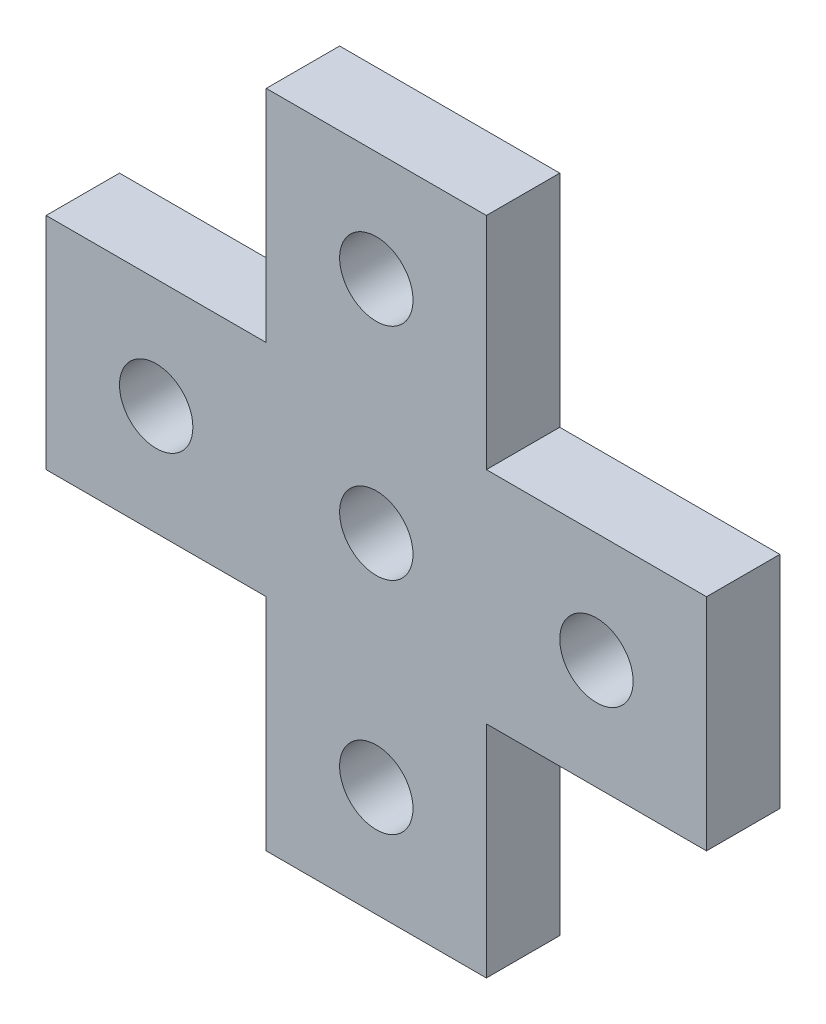
ISO-10303-21;
HEADER;
FILE_DESCRIPTION(('STEP AP214'),'2;1');
FILE_NAME('part.step','',(''),(''),'','','');
FILE_SCHEMA(('AUTOMOTIVE_DESIGN { 1 0 10303 214 1 1 1 1 }'));
ENDSEC;
DATA;
#1=APPLICATION_CONTEXT('core data for automotive mechanical design processes');
#2=APPLICATION_PROTOCOL_DEFINITION('international standard','automotive_design',2000,#1);
#3=PRODUCT_CONTEXT('',#1,'mechanical');
#4=PRODUCT('Part','Part','',(#3));
#5=PRODUCT_RELATED_PRODUCT_CATEGORY('part','',(#4));
#6=PRODUCT_DEFINITION_FORMATION('','',#4);
#7=PRODUCT_DEFINITION_CONTEXT('part definition',#1,'design');
#8=PRODUCT_DEFINITION('design','',#6,#7);
#9=PRODUCT_DEFINITION_SHAPE('','',#8);
#10=(LENGTH_UNIT() NAMED_UNIT(*) SI_UNIT(.MILLI.,.METRE.));
#11=(NAMED_UNIT(*) PLANE_ANGLE_UNIT() SI_UNIT($,.RADIAN.));
#12=(NAMED_UNIT(*) SI_UNIT($,.STERADIAN.) SOLID_ANGLE_UNIT());
#13=UNCERTAINTY_MEASURE_WITH_UNIT(LENGTH_MEASURE(1.E-05),#10,'distance_accuracy_value','');
#14=(GEOMETRIC_REPRESENTATION_CONTEXT(3) GLOBAL_UNCERTAINTY_ASSIGNED_CONTEXT((#13)) GLOBAL_UNIT_ASSIGNED_CONTEXT((#10,
#11,#12)) REPRESENTATION_CONTEXT('',''));
#15=CARTESIAN_POINT('',(0.,0.,0.));
#16=DIRECTION('',(0.,0.,1.));
#17=DIRECTION('',(1.,0.,0.));
#18=AXIS2_PLACEMENT_3D('',#15,#16,#17);
#19=CARTESIAN_POINT('',(0.,0.,3.));
#20=DIRECTION('',(0.,0.,-1.));
#21=DIRECTION('',(-1.,0.,0.));
#22=AXIS2_PLACEMENT_3D('',#19,#20,#21);
#23=PLANE('',#22);
#24=CARTESIAN_POINT('',(199.7507761496,161.428489513,3.));
#25=DIRECTION('',(0.,0.,1.));
#26=DIRECTION('',(1.,0.,0.));
#27=AXIS2_PLACEMENT_3D('',#24,#25,#26);
#28=CIRCLE('',#27,1.5);
#29=CARTESIAN_POINT('',(201.2507761496,161.428489513,3.));
#30=VERTEX_POINT('',#29);
#31=EDGE_CURVE('E296',#30,#30,#28,.T.);
#32=ORIENTED_EDGE('',*,*,#31,.F.);
#33=EDGE_LOOP('',(#32));
#34=FACE_BOUND('',#33,.T.);
#35=CARTESIAN_POINT('',(208.7507761496,161.428489513,3.));
#36=DIRECTION('',(0.,0.,1.));
#37=DIRECTION('',(1.,0.,0.));
#38=AXIS2_PLACEMENT_3D('',#35,#36,#37);
#39=CIRCLE('',#38,1.5);
#40=CARTESIAN_POINT('',(210.2507761496,161.428489513,3.));
#41=VERTEX_POINT('',#40);
#42=EDGE_CURVE('E308',#41,#41,#39,.T.);
#43=ORIENTED_EDGE('',*,*,#42,.F.);
#44=EDGE_LOOP('',(#43));
#45=FACE_BOUND('',#44,.T.);
#46=DIRECTION('',(-1.,0.,0.));
#47=VECTOR('',#46,1.);
#48=CARTESIAN_POINT('',(222.2507761496,165.928489513,3.));
#49=LINE('',#48,#47);
#50=CARTESIAN_POINT('',(222.2507761496,165.928489513,3.));
#51=VERTEX_POINT('',#50);
#52=CARTESIAN_POINT('',(213.2507761496,165.928489513,3.));
#53=VERTEX_POINT('',#52);
#54=EDGE_CURVE('E177',#51,#53,#49,.T.);
#55=ORIENTED_EDGE('',*,*,#54,.T.);
#56=DIRECTION('',(0.,1.,0.));
#57=VECTOR('',#56,1.);
#58=CARTESIAN_POINT('',(213.2507761496,165.928489513,3.));
#59=LINE('',#58,#57);
#60=CARTESIAN_POINT('',(213.2507761496,174.928489513,3.));
#61=VERTEX_POINT('',#60);
#62=EDGE_CURVE('E105',#53,#61,#59,.T.);
#63=ORIENTED_EDGE('',*,*,#62,.T.);
#64=DIRECTION('',(-1.,0.,0.));
#65=VECTOR('',#64,1.);
#66=CARTESIAN_POINT('',(213.2507761496,174.928489513,3.));
#67=LINE('',#66,#65);
#68=CARTESIAN_POINT('',(204.2507761496,174.928489513,3.));
#69=VERTEX_POINT('',#68);
#70=EDGE_CURVE('E204',#61,#69,#67,.T.);
#71=ORIENTED_EDGE('',*,*,#70,.T.);
#72=DIRECTION('',(0.,-1.,0.));
#73=VECTOR('',#72,1.);
#74=CARTESIAN_POINT('',(204.2507761496,174.928489513,3.));
#75=LINE('',#74,#73);
#76=CARTESIAN_POINT('',(204.2507761496,165.928489513,3.));
#77=VERTEX_POINT('',#76);
#78=EDGE_CURVE('E223',#69,#77,#75,.T.);
#79=ORIENTED_EDGE('',*,*,#78,.T.);
#80=DIRECTION('',(-1.,0.,0.));
#81=VECTOR('',#80,1.);
#82=CARTESIAN_POINT('',(204.2507761496,165.928489513,3.));
#83=LINE('',#82,#81);
#84=CARTESIAN_POINT('',(195.2507761496,165.928489513,3.));
#85=VERTEX_POINT('',#84);
#86=EDGE_CURVE('E220',#77,#85,#83,.T.);
#87=ORIENTED_EDGE('',*,*,#86,.T.);
#88=DIRECTION('',(0.,-1.,0.));
#89=VECTOR('',#88,1.);
#90=CARTESIAN_POINT('',(195.2507761496,165.928489513,3.));
#91=LINE('',#90,#89);
#92=CARTESIAN_POINT('',(195.2507761496,156.928489513,3.));
#93=VERTEX_POINT('',#92);
#94=EDGE_CURVE('E222',#85,#93,#91,.T.);
#95=ORIENTED_EDGE('',*,*,#94,.T.);
#96=DIRECTION('',(1.,0.,0.));
#97=VECTOR('',#96,1.);
#98=CARTESIAN_POINT('',(195.2507761496,156.928489513,3.));
#99=LINE('',#98,#97);
#100=CARTESIAN_POINT('',(204.2507761496,156.928489513,3.));
#101=VERTEX_POINT('',#100);
#102=EDGE_CURVE('E225',#93,#101,#99,.T.);
#103=ORIENTED_EDGE('',*,*,#102,.T.);
#104=DIRECTION('',(0.,-1.,0.));
#105=VECTOR('',#104,1.);
#106=CARTESIAN_POINT('',(204.2507761496,156.928489513,3.));
#107=LINE('',#106,#105);
#108=CARTESIAN_POINT('',(204.2507761496,147.928489513,3.));
#109=VERTEX_POINT('',#108);
#110=EDGE_CURVE('E231',#101,#109,#107,.T.);
#111=ORIENTED_EDGE('',*,*,#110,.T.);
#112=DIRECTION('',(1.,0.,0.));
#113=VECTOR('',#112,1.);
#114=CARTESIAN_POINT('',(213.2507761496,147.928489513,3.));
#115=LINE('',#114,#113);
#116=CARTESIAN_POINT('',(213.2507761496,147.928489513,3.));
#117=VERTEX_POINT('',#116);
#118=EDGE_CURVE('E136',#109,#117,#115,.T.);
#119=ORIENTED_EDGE('',*,*,#118,.T.);
#120=DIRECTION('',(0.,1.,0.));
#121=VECTOR('',#120,1.);
#122=CARTESIAN_POINT('',(213.2507761496,147.928489513,3.));
#123=LINE('',#122,#121);
#124=CARTESIAN_POINT('',(213.2507761496,156.928489513,3.));
#125=VERTEX_POINT('',#124);
#126=EDGE_CURVE('E130',#117,#125,#123,.T.);
#127=ORIENTED_EDGE('',*,*,#126,.T.);
#128=DIRECTION('',(1.,0.,0.));
#129=VECTOR('',#128,1.);
#130=CARTESIAN_POINT('',(213.2507761496,156.928489513,3.));
#131=LINE('',#130,#129);
#132=CARTESIAN_POINT('',(222.2507761496,156.928489513,3.));
#133=VERTEX_POINT('',#132);
#134=EDGE_CURVE('E134',#125,#133,#131,.T.);
#135=ORIENTED_EDGE('',*,*,#134,.T.);
#136=DIRECTION('',(0.,1.,0.));
#137=VECTOR('',#136,1.);
#138=CARTESIAN_POINT('',(222.2507761496,165.928489513,3.));
#139=LINE('',#138,#137);
#140=EDGE_CURVE('E50',#133,#51,#139,.T.);
#141=ORIENTED_EDGE('',*,*,#140,.T.);
#142=EDGE_LOOP('',(#55,#63,#71,#79,#87,#95,#103,#111,#119,#127,#135,#141));
#143=FACE_BOUND('',#142,.T.);
#144=CARTESIAN_POINT('',(208.7507761496,152.428489513,3.));
#145=DIRECTION('',(0.,0.,1.));
#146=DIRECTION('',(1.,0.,0.));
#147=AXIS2_PLACEMENT_3D('',#144,#145,#146);
#148=CIRCLE('',#147,1.5);
#149=CARTESIAN_POINT('',(210.2507761496,152.428489513,3.));
#150=VERTEX_POINT('',#149);
#151=EDGE_CURVE('E158',#150,#150,#148,.T.);
#152=ORIENTED_EDGE('',*,*,#151,.F.);
#153=EDGE_LOOP('',(#152));
#154=FACE_BOUND('',#153,.T.);
#155=CARTESIAN_POINT('',(208.7507761496,170.428489513,3.));
#156=DIRECTION('',(0.,0.,1.));
#157=DIRECTION('',(1.,0.,0.));
#158=AXIS2_PLACEMENT_3D('',#155,#156,#157);
#159=CIRCLE('',#158,1.5);
#160=CARTESIAN_POINT('',(210.2507761496,170.428489513,3.));
#161=VERTEX_POINT('',#160);
#162=EDGE_CURVE('E302',#161,#161,#159,.T.);
#163=ORIENTED_EDGE('',*,*,#162,.F.);
#164=EDGE_LOOP('',(#163));
#165=FACE_BOUND('',#164,.T.);
#166=CARTESIAN_POINT('',(217.7507761496,161.428489513,3.));
#167=DIRECTION('',(0.,0.,1.));
#168=DIRECTION('',(1.,0.,0.));
#169=AXIS2_PLACEMENT_3D('',#166,#167,#168);
#170=CIRCLE('',#169,1.5);
#171=CARTESIAN_POINT('',(219.2507761496,161.428489513,3.));
#172=VERTEX_POINT('',#171);
#173=EDGE_CURVE('E287',#172,#172,#170,.T.);
#174=ORIENTED_EDGE('',*,*,#173,.F.);
#175=EDGE_LOOP('',(#174));
#176=FACE_BOUND('',#175,.T.);
#177=ADVANCED_FACE('F33',(#34,#45,#143,#154,#165,#176),#23,.F.);
#178=CARTESIAN_POINT('',(0.,0.,0.));
#179=DIRECTION('',(0.,0.,-1.));
#180=DIRECTION('',(-1.,0.,0.));
#181=AXIS2_PLACEMENT_3D('',#178,#179,#180);
#182=PLANE('',#181);
#183=CARTESIAN_POINT('',(199.7507761496,161.428489513,0.));
#184=DIRECTION('',(0.,0.,1.));
#185=DIRECTION('',(1.,0.,0.));
#186=AXIS2_PLACEMENT_3D('',#183,#184,#185);
#187=CIRCLE('',#186,1.5);
#188=CARTESIAN_POINT('',(201.2507761496,161.428489513,0.));
#189=VERTEX_POINT('',#188);
#190=EDGE_CURVE('E293',#189,#189,#187,.T.);
#191=ORIENTED_EDGE('',*,*,#190,.T.);
#192=EDGE_LOOP('',(#191));
#193=FACE_BOUND('',#192,.T.);
#194=CARTESIAN_POINT('',(208.7507761496,161.428489513,0.));
#195=DIRECTION('',(0.,0.,1.));
#196=DIRECTION('',(1.,0.,0.));
#197=AXIS2_PLACEMENT_3D('',#194,#195,#196);
#198=CIRCLE('',#197,1.5);
#199=CARTESIAN_POINT('',(210.2507761496,161.428489513,0.));
#200=VERTEX_POINT('',#199);
#201=EDGE_CURVE('E305',#200,#200,#198,.T.);
#202=ORIENTED_EDGE('',*,*,#201,.T.);
#203=EDGE_LOOP('',(#202));
#204=FACE_BOUND('',#203,.T.);
#205=DIRECTION('',(-1.,0.,0.));
#206=VECTOR('',#205,1.);
#207=CARTESIAN_POINT('',(222.2507761496,165.928489513,0.));
#208=LINE('',#207,#206);
#209=CARTESIAN_POINT('',(222.2507761496,165.928489513,0.));
#210=VERTEX_POINT('',#209);
#211=CARTESIAN_POINT('',(213.2507761496,165.928489513,0.));
#212=VERTEX_POINT('',#211);
#213=EDGE_CURVE('E154',#210,#212,#208,.T.);
#214=ORIENTED_EDGE('',*,*,#213,.F.);
#215=DIRECTION('',(0.,1.,0.));
#216=VECTOR('',#215,1.);
#217=CARTESIAN_POINT('',(222.2507761496,165.928489513,0.));
#218=LINE('',#217,#216);
#219=CARTESIAN_POINT('',(222.2507761496,156.928489513,0.));
#220=VERTEX_POINT('',#219);
#221=EDGE_CURVE('E97',#220,#210,#218,.T.);
#222=ORIENTED_EDGE('',*,*,#221,.F.);
#223=DIRECTION('',(1.,0.,0.));
#224=VECTOR('',#223,1.);
#225=CARTESIAN_POINT('',(213.2507761496,156.928489513,0.));
#226=LINE('',#225,#224);
#227=CARTESIAN_POINT('',(213.2507761496,156.928489513,0.));
#228=VERTEX_POINT('',#227);
#229=EDGE_CURVE('E91',#228,#220,#226,.T.);
#230=ORIENTED_EDGE('',*,*,#229,.F.);
#231=DIRECTION('',(0.,1.,0.));
#232=VECTOR('',#231,1.);
#233=CARTESIAN_POINT('',(213.2507761496,147.928489513,0.));
#234=LINE('',#233,#232);
#235=CARTESIAN_POINT('',(213.2507761496,147.928489513,0.));
#236=VERTEX_POINT('',#235);
#237=EDGE_CURVE('E144',#236,#228,#234,.T.);
#238=ORIENTED_EDGE('',*,*,#237,.F.);
#239=DIRECTION('',(1.,0.,0.));
#240=VECTOR('',#239,1.);
#241=CARTESIAN_POINT('',(213.2507761496,147.928489513,0.));
#242=LINE('',#241,#240);
#243=CARTESIAN_POINT('',(204.2507761496,147.928489513,0.));
#244=VERTEX_POINT('',#243);
#245=EDGE_CURVE('E172',#244,#236,#242,.T.);
#246=ORIENTED_EDGE('',*,*,#245,.F.);
#247=DIRECTION('',(0.,-1.,0.));
#248=VECTOR('',#247,1.);
#249=CARTESIAN_POINT('',(204.2507761496,156.928489513,0.));
#250=LINE('',#249,#248);
#251=CARTESIAN_POINT('',(204.2507761496,156.928489513,0.));
#252=VERTEX_POINT('',#251);
#253=EDGE_CURVE('E170',#252,#244,#250,.T.);
#254=ORIENTED_EDGE('',*,*,#253,.F.);
#255=DIRECTION('',(1.,0.,0.));
#256=VECTOR('',#255,1.);
#257=CARTESIAN_POINT('',(195.2507761496,156.928489513,0.));
#258=LINE('',#257,#256);
#259=CARTESIAN_POINT('',(195.2507761496,156.928489513,0.));
#260=VERTEX_POINT('',#259);
#261=EDGE_CURVE('E168',#260,#252,#258,.T.);
#262=ORIENTED_EDGE('',*,*,#261,.F.);
#263=DIRECTION('',(0.,-1.,0.));
#264=VECTOR('',#263,1.);
#265=CARTESIAN_POINT('',(195.2507761496,165.928489513,0.));
#266=LINE('',#265,#264);
#267=CARTESIAN_POINT('',(195.2507761496,165.928489513,0.));
#268=VERTEX_POINT('',#267);
#269=EDGE_CURVE('E166',#268,#260,#266,.T.);
#270=ORIENTED_EDGE('',*,*,#269,.F.);
#271=DIRECTION('',(-1.,0.,0.));
#272=VECTOR('',#271,1.);
#273=CARTESIAN_POINT('',(204.2507761496,165.928489513,0.));
#274=LINE('',#273,#272);
#275=CARTESIAN_POINT('',(204.2507761496,165.928489513,0.));
#276=VERTEX_POINT('',#275);
#277=EDGE_CURVE('E164',#276,#268,#274,.T.);
#278=ORIENTED_EDGE('',*,*,#277,.F.);
#279=DIRECTION('',(0.,-1.,0.));
#280=VECTOR('',#279,1.);
#281=CARTESIAN_POINT('',(204.2507761496,174.928489513,0.));
#282=LINE('',#281,#280);
#283=CARTESIAN_POINT('',(204.2507761496,174.928489513,0.));
#284=VERTEX_POINT('',#283);
#285=EDGE_CURVE('E162',#284,#276,#282,.T.);
#286=ORIENTED_EDGE('',*,*,#285,.F.);
#287=DIRECTION('',(-1.,0.,0.));
#288=VECTOR('',#287,1.);
#289=CARTESIAN_POINT('',(213.2507761496,174.928489513,0.));
#290=LINE('',#289,#288);
#291=CARTESIAN_POINT('',(213.2507761496,174.928489513,0.));
#292=VERTEX_POINT('',#291);
#293=EDGE_CURVE('E160',#292,#284,#290,.T.);
#294=ORIENTED_EDGE('',*,*,#293,.F.);
#295=DIRECTION('',(0.,1.,0.));
#296=VECTOR('',#295,1.);
#297=CARTESIAN_POINT('',(213.2507761496,165.928489513,0.));
#298=LINE('',#297,#296);
#299=EDGE_CURVE('E157',#212,#292,#298,.T.);
#300=ORIENTED_EDGE('',*,*,#299,.F.);
#301=EDGE_LOOP('',(#214,#222,#230,#238,#246,#254,#262,#270,#278,#286,#294,#300));
#302=FACE_BOUND('',#301,.T.);
#303=CARTESIAN_POINT('',(208.7507761496,152.428489513,0.));
#304=DIRECTION('',(0.,0.,1.));
#305=DIRECTION('',(1.,0.,0.));
#306=AXIS2_PLACEMENT_3D('',#303,#304,#305);
#307=CIRCLE('',#306,1.5);
#308=CARTESIAN_POINT('',(210.2507761496,152.428489513,0.));
#309=VERTEX_POINT('',#308);
#310=EDGE_CURVE('E311',#309,#309,#307,.T.);
#311=ORIENTED_EDGE('',*,*,#310,.T.);
#312=EDGE_LOOP('',(#311));
#313=FACE_BOUND('',#312,.T.);
#314=CARTESIAN_POINT('',(208.7507761496,170.428489513,0.));
#315=DIRECTION('',(0.,0.,1.));
#316=DIRECTION('',(1.,0.,0.));
#317=AXIS2_PLACEMENT_3D('',#314,#315,#316);
#318=CIRCLE('',#317,1.5);
#319=CARTESIAN_POINT('',(210.2507761496,170.428489513,0.));
#320=VERTEX_POINT('',#319);
#321=EDGE_CURVE('E299',#320,#320,#318,.T.);
#322=ORIENTED_EDGE('',*,*,#321,.T.);
#323=EDGE_LOOP('',(#322));
#324=FACE_BOUND('',#323,.T.);
#325=CARTESIAN_POINT('',(217.7507761496,161.428489513,0.));
#326=DIRECTION('',(0.,0.,1.));
#327=DIRECTION('',(1.,0.,0.));
#328=AXIS2_PLACEMENT_3D('',#325,#326,#327);
#329=CIRCLE('',#328,1.5);
#330=CARTESIAN_POINT('',(219.2507761496,161.428489513,0.));
#331=VERTEX_POINT('',#330);
#332=EDGE_CURVE('E290',#331,#331,#329,.T.);
#333=ORIENTED_EDGE('',*,*,#332,.T.);
#334=EDGE_LOOP('',(#333));
#335=FACE_BOUND('',#334,.T.);
#336=ADVANCED_FACE('F208',(#193,#204,#302,#313,#324,#335),#182,.T.);
#337=CARTESIAN_POINT('',(222.2507761496,165.928489513,3.));
#338=DIRECTION('',(0.,-1.,0.));
#339=DIRECTION('',(0.,0.,-1.));
#340=AXIS2_PLACEMENT_3D('',#337,#338,#339);
#341=PLANE('',#340);
#342=ORIENTED_EDGE('',*,*,#213,.T.);
#343=DIRECTION('',(0.,0.,-1.));
#344=VECTOR('',#343,1.);
#345=CARTESIAN_POINT('',(213.2507761496,165.928489513,3.));
#346=LINE('',#345,#344);
#347=EDGE_CURVE('E11',#53,#212,#346,.T.);
#348=ORIENTED_EDGE('',*,*,#347,.F.);
#349=ORIENTED_EDGE('',*,*,#54,.F.);
#350=DIRECTION('',(0.,0.,-1.));
#351=VECTOR('',#350,1.);
#352=CARTESIAN_POINT('',(222.2507761496,165.928489513,3.));
#353=LINE('',#352,#351);
#354=EDGE_CURVE('E150',#51,#210,#353,.T.);
#355=ORIENTED_EDGE('',*,*,#354,.T.);
#356=EDGE_LOOP('',(#342,#348,#349,#355));
#357=FACE_BOUND('',#356,.T.);
#358=ADVANCED_FACE('F35',(#357),#341,.F.);
#359=CARTESIAN_POINT('',(213.2507761496,165.928489513,3.));
#360=DIRECTION('',(-1.,0.,0.));
#361=DIRECTION('',(0.,0.,1.));
#362=AXIS2_PLACEMENT_3D('',#359,#360,#361);
#363=PLANE('',#362);
#364=ORIENTED_EDGE('',*,*,#299,.T.);
#365=DIRECTION('',(0.,0.,-1.));
#366=VECTOR('',#365,1.);
#367=CARTESIAN_POINT('',(213.2507761496,174.928489513,3.));
#368=LINE('',#367,#366);
#369=EDGE_CURVE('E42',#61,#292,#368,.T.);
#370=ORIENTED_EDGE('',*,*,#369,.F.);
#371=ORIENTED_EDGE('',*,*,#62,.F.);
#372=ORIENTED_EDGE('',*,*,#347,.T.);
#373=EDGE_LOOP('',(#364,#370,#371,#372));
#374=FACE_BOUND('',#373,.T.);
#375=ADVANCED_FACE('F429',(#374),#363,.F.);
#376=CARTESIAN_POINT('',(213.2507761496,174.928489513,3.));
#377=DIRECTION('',(0.,-1.,0.));
#378=DIRECTION('',(0.,0.,-1.));
#379=AXIS2_PLACEMENT_3D('',#376,#377,#378);
#380=PLANE('',#379);
#381=ORIENTED_EDGE('',*,*,#293,.T.);
#382=DIRECTION('',(0.,0.,-1.));
#383=VECTOR('',#382,1.);
#384=CARTESIAN_POINT('',(204.2507761496,174.928489513,3.));
#385=LINE('',#384,#383);
#386=EDGE_CURVE('E196',#69,#284,#385,.T.);
#387=ORIENTED_EDGE('',*,*,#386,.F.);
#388=ORIENTED_EDGE('',*,*,#70,.F.);
#389=ORIENTED_EDGE('',*,*,#369,.T.);
#390=EDGE_LOOP('',(#381,#387,#388,#389));
#391=FACE_BOUND('',#390,.T.);
#392=ADVANCED_FACE('F202',(#391),#380,.F.);
#393=CARTESIAN_POINT('',(204.2507761496,174.928489513,3.));
#394=DIRECTION('',(1.,0.,0.));
#395=DIRECTION('',(0.,0.,-1.));
#396=AXIS2_PLACEMENT_3D('',#393,#394,#395);
#397=PLANE('',#396);
#398=ORIENTED_EDGE('',*,*,#285,.T.);
#399=DIRECTION('',(0.,0.,-1.));
#400=VECTOR('',#399,1.);
#401=CARTESIAN_POINT('',(204.2507761496,165.928489513,3.));
#402=LINE('',#401,#400);
#403=EDGE_CURVE('E193',#77,#276,#402,.T.);
#404=ORIENTED_EDGE('',*,*,#403,.F.);
#405=ORIENTED_EDGE('',*,*,#78,.F.);
#406=ORIENTED_EDGE('',*,*,#386,.T.);
#407=EDGE_LOOP('',(#398,#404,#405,#406));
#408=FACE_BOUND('',#407,.T.);
#409=ADVANCED_FACE('F214',(#408),#397,.F.);
#410=CARTESIAN_POINT('',(204.2507761496,165.928489513,3.));
#411=DIRECTION('',(0.,-1.,0.));
#412=DIRECTION('',(0.,0.,-1.));
#413=AXIS2_PLACEMENT_3D('',#410,#411,#412);
#414=PLANE('',#413);
#415=ORIENTED_EDGE('',*,*,#277,.T.);
#416=DIRECTION('',(0.,0.,-1.));
#417=VECTOR('',#416,1.);
#418=CARTESIAN_POINT('',(195.2507761496,165.928489513,3.));
#419=LINE('',#418,#417);
#420=EDGE_CURVE('E190',#85,#268,#419,.T.);
#421=ORIENTED_EDGE('',*,*,#420,.F.);
#422=ORIENTED_EDGE('',*,*,#86,.F.);
#423=ORIENTED_EDGE('',*,*,#403,.T.);
#424=EDGE_LOOP('',(#415,#421,#422,#423));
#425=FACE_BOUND('',#424,.T.);
#426=ADVANCED_FACE('F218',(#425),#414,.F.);
#427=CARTESIAN_POINT('',(195.2507761496,165.928489513,3.));
#428=DIRECTION('',(1.,0.,0.));
#429=DIRECTION('',(0.,0.,-1.));
#430=AXIS2_PLACEMENT_3D('',#427,#428,#429);
#431=PLANE('',#430);
#432=ORIENTED_EDGE('',*,*,#269,.T.);
#433=DIRECTION('',(0.,0.,-1.));
#434=VECTOR('',#433,1.);
#435=CARTESIAN_POINT('',(195.2507761496,156.928489513,3.));
#436=LINE('',#435,#434);
#437=EDGE_CURVE('E187',#93,#260,#436,.T.);
#438=ORIENTED_EDGE('',*,*,#437,.F.);
#439=ORIENTED_EDGE('',*,*,#94,.F.);
#440=ORIENTED_EDGE('',*,*,#420,.T.);
#441=EDGE_LOOP('',(#432,#438,#439,#440));
#442=FACE_BOUND('',#441,.T.);
#443=ADVANCED_FACE('F394',(#442),#431,.F.);
#444=CARTESIAN_POINT('',(195.2507761496,156.928489513,3.));
#445=DIRECTION('',(0.,1.,0.));
#446=DIRECTION('',(0.,0.,1.));
#447=AXIS2_PLACEMENT_3D('',#444,#445,#446);
#448=PLANE('',#447);
#449=ORIENTED_EDGE('',*,*,#261,.T.);
#450=DIRECTION('',(0.,0.,-1.));
#451=VECTOR('',#450,1.);
#452=CARTESIAN_POINT('',(204.2507761496,156.928489513,3.));
#453=LINE('',#452,#451);
#454=EDGE_CURVE('E184',#101,#252,#453,.T.);
#455=ORIENTED_EDGE('',*,*,#454,.F.);
#456=ORIENTED_EDGE('',*,*,#102,.F.);
#457=ORIENTED_EDGE('',*,*,#437,.T.);
#458=EDGE_LOOP('',(#449,#455,#456,#457));
#459=FACE_BOUND('',#458,.T.);
#460=ADVANCED_FACE('F385',(#459),#448,.F.);
#461=CARTESIAN_POINT('',(204.2507761496,156.928489513,3.));
#462=DIRECTION('',(1.,0.,0.));
#463=DIRECTION('',(0.,0.,-1.));
#464=AXIS2_PLACEMENT_3D('',#461,#462,#463);
#465=PLANE('',#464);
#466=ORIENTED_EDGE('',*,*,#253,.T.);
#467=DIRECTION('',(0.,0.,-1.));
#468=VECTOR('',#467,1.);
#469=CARTESIAN_POINT('',(204.2507761496,147.928489513,3.));
#470=LINE('',#469,#468);
#471=EDGE_CURVE('E181',#109,#244,#470,.T.);
#472=ORIENTED_EDGE('',*,*,#471,.F.);
#473=ORIENTED_EDGE('',*,*,#110,.F.);
#474=ORIENTED_EDGE('',*,*,#454,.T.);
#475=EDGE_LOOP('',(#466,#472,#473,#474));
#476=FACE_BOUND('',#475,.T.);
#477=ADVANCED_FACE('F237',(#476),#465,.F.);
#478=CARTESIAN_POINT('',(213.2507761496,147.928489513,3.));
#479=DIRECTION('',(0.,1.,0.));
#480=DIRECTION('',(0.,0.,1.));
#481=AXIS2_PLACEMENT_3D('',#478,#479,#480);
#482=PLANE('',#481);
#483=ORIENTED_EDGE('',*,*,#245,.T.);
#484=DIRECTION('',(0.,0.,-1.));
#485=VECTOR('',#484,1.);
#486=CARTESIAN_POINT('',(213.2507761496,147.928489513,3.));
#487=LINE('',#486,#485);
#488=EDGE_CURVE('E145',#117,#236,#487,.T.);
#489=ORIENTED_EDGE('',*,*,#488,.F.);
#490=ORIENTED_EDGE('',*,*,#118,.F.);
#491=ORIENTED_EDGE('',*,*,#471,.T.);
#492=EDGE_LOOP('',(#483,#489,#490,#491));
#493=FACE_BOUND('',#492,.T.);
#494=ADVANCED_FACE('F241',(#493),#482,.F.);
#495=CARTESIAN_POINT('',(213.2507761496,147.928489513,3.));
#496=DIRECTION('',(-1.,0.,0.));
#497=DIRECTION('',(0.,0.,1.));
#498=AXIS2_PLACEMENT_3D('',#495,#496,#497);
#499=PLANE('',#498);
#500=ORIENTED_EDGE('',*,*,#237,.T.);
#501=DIRECTION('',(0.,0.,-1.));
#502=VECTOR('',#501,1.);
#503=CARTESIAN_POINT('',(213.2507761496,156.928489513,3.));
#504=LINE('',#503,#502);
#505=EDGE_CURVE('E141',#125,#228,#504,.T.);
#506=ORIENTED_EDGE('',*,*,#505,.F.);
#507=ORIENTED_EDGE('',*,*,#126,.F.);
#508=ORIENTED_EDGE('',*,*,#488,.T.);
#509=EDGE_LOOP('',(#500,#506,#507,#508));
#510=FACE_BOUND('',#509,.T.);
#511=ADVANCED_FACE('F142',(#510),#499,.F.);
#512=CARTESIAN_POINT('',(213.2507761496,156.928489513,3.));
#513=DIRECTION('',(0.,1.,0.));
#514=DIRECTION('',(0.,0.,1.));
#515=AXIS2_PLACEMENT_3D('',#512,#513,#514);
#516=PLANE('',#515);
#517=ORIENTED_EDGE('',*,*,#229,.T.);
#518=DIRECTION('',(0.,0.,-1.));
#519=VECTOR('',#518,1.);
#520=CARTESIAN_POINT('',(222.2507761496,156.928489513,3.));
#521=LINE('',#520,#519);
#522=EDGE_CURVE('E146',#133,#220,#521,.T.);
#523=ORIENTED_EDGE('',*,*,#522,.F.);
#524=ORIENTED_EDGE('',*,*,#134,.F.);
#525=ORIENTED_EDGE('',*,*,#505,.T.);
#526=EDGE_LOOP('',(#517,#523,#524,#525));
#527=FACE_BOUND('',#526,.T.);
#528=ADVANCED_FACE('F148',(#527),#516,.F.);
#529=CARTESIAN_POINT('',(222.2507761496,165.928489513,3.));
#530=DIRECTION('',(-1.,0.,0.));
#531=DIRECTION('',(0.,0.,1.));
#532=AXIS2_PLACEMENT_3D('',#529,#530,#531);
#533=PLANE('',#532);
#534=ORIENTED_EDGE('',*,*,#221,.T.);
#535=ORIENTED_EDGE('',*,*,#354,.F.);
#536=ORIENTED_EDGE('',*,*,#140,.F.);
#537=ORIENTED_EDGE('',*,*,#522,.T.);
#538=EDGE_LOOP('',(#534,#535,#536,#537));
#539=FACE_BOUND('',#538,.T.);
#540=ADVANCED_FACE('F245',(#539),#533,.F.);
#541=CARTESIAN_POINT('',(208.7507761496,152.428489513,3.));
#542=DIRECTION('',(0.,0.,-1.));
#543=DIRECTION('',(-1.,0.,0.));
#544=AXIS2_PLACEMENT_3D('',#541,#542,#543);
#545=CYLINDRICAL_SURFACE('',#544,1.5);
#546=ORIENTED_EDGE('',*,*,#151,.T.);
#547=EDGE_LOOP('',(#546));
#548=FACE_BOUND('',#547,.T.);
#549=ORIENTED_EDGE('',*,*,#310,.F.);
#550=EDGE_LOOP('',(#549));
#551=FACE_BOUND('',#550,.T.);
#552=ADVANCED_FACE('F247',(#548,#551),#545,.F.);
#553=CARTESIAN_POINT('',(208.7507761496,161.428489513,3.));
#554=DIRECTION('',(0.,0.,-1.));
#555=DIRECTION('',(-1.,0.,0.));
#556=AXIS2_PLACEMENT_3D('',#553,#554,#555);
#557=CYLINDRICAL_SURFACE('',#556,1.5);
#558=ORIENTED_EDGE('',*,*,#42,.T.);
#559=EDGE_LOOP('',(#558));
#560=FACE_BOUND('',#559,.T.);
#561=ORIENTED_EDGE('',*,*,#201,.F.);
#562=EDGE_LOOP('',(#561));
#563=FACE_BOUND('',#562,.T.);
#564=ADVANCED_FACE('F253',(#560,#563),#557,.F.);
#565=CARTESIAN_POINT('',(208.7507761496,170.428489513,3.));
#566=DIRECTION('',(0.,0.,-1.));
#567=DIRECTION('',(-1.,0.,0.));
#568=AXIS2_PLACEMENT_3D('',#565,#566,#567);
#569=CYLINDRICAL_SURFACE('',#568,1.5);
#570=ORIENTED_EDGE('',*,*,#162,.T.);
#571=EDGE_LOOP('',(#570));
#572=FACE_BOUND('',#571,.T.);
#573=ORIENTED_EDGE('',*,*,#321,.F.);
#574=EDGE_LOOP('',(#573));
#575=FACE_BOUND('',#574,.T.);
#576=ADVANCED_FACE('F270',(#572,#575),#569,.F.);
#577=CARTESIAN_POINT('',(199.7507761496,161.428489513,3.));
#578=DIRECTION('',(0.,0.,-1.));
#579=DIRECTION('',(-1.,0.,0.));
#580=AXIS2_PLACEMENT_3D('',#577,#578,#579);
#581=CYLINDRICAL_SURFACE('',#580,1.5);
#582=ORIENTED_EDGE('',*,*,#31,.T.);
#583=EDGE_LOOP('',(#582));
#584=FACE_BOUND('',#583,.T.);
#585=ORIENTED_EDGE('',*,*,#190,.F.);
#586=EDGE_LOOP('',(#585));
#587=FACE_BOUND('',#586,.T.);
#588=ADVANCED_FACE('F274',(#584,#587),#581,.F.);
#589=CARTESIAN_POINT('',(217.7507761496,161.428489513,3.));
#590=DIRECTION('',(0.,0.,-1.));
#591=DIRECTION('',(-1.,0.,0.));
#592=AXIS2_PLACEMENT_3D('',#589,#590,#591);
#593=CYLINDRICAL_SURFACE('',#592,1.5);
#594=ORIENTED_EDGE('',*,*,#173,.T.);
#595=EDGE_LOOP('',(#594));
#596=FACE_BOUND('',#595,.T.);
#597=ORIENTED_EDGE('',*,*,#332,.F.);
#598=EDGE_LOOP('',(#597));
#599=FACE_BOUND('',#598,.T.);
#600=ADVANCED_FACE('F278',(#596,#599),#593,.F.);
#601=CLOSED_SHELL('',(#177,#336,#358,#375,#392,#409,#426,#443,#460,#477,#494,#511,#528,#540,
#552,#564,#576,#588,#600));
#602=MANIFOLD_SOLID_BREP('B2',#601);
#603=ADVANCED_BREP_SHAPE_REPRESENTATION('',(#18,#602),#14);
#604=SHAPE_DEFINITION_REPRESENTATION(#9,#603);
ENDSEC;
END-ISO-10303-21;
